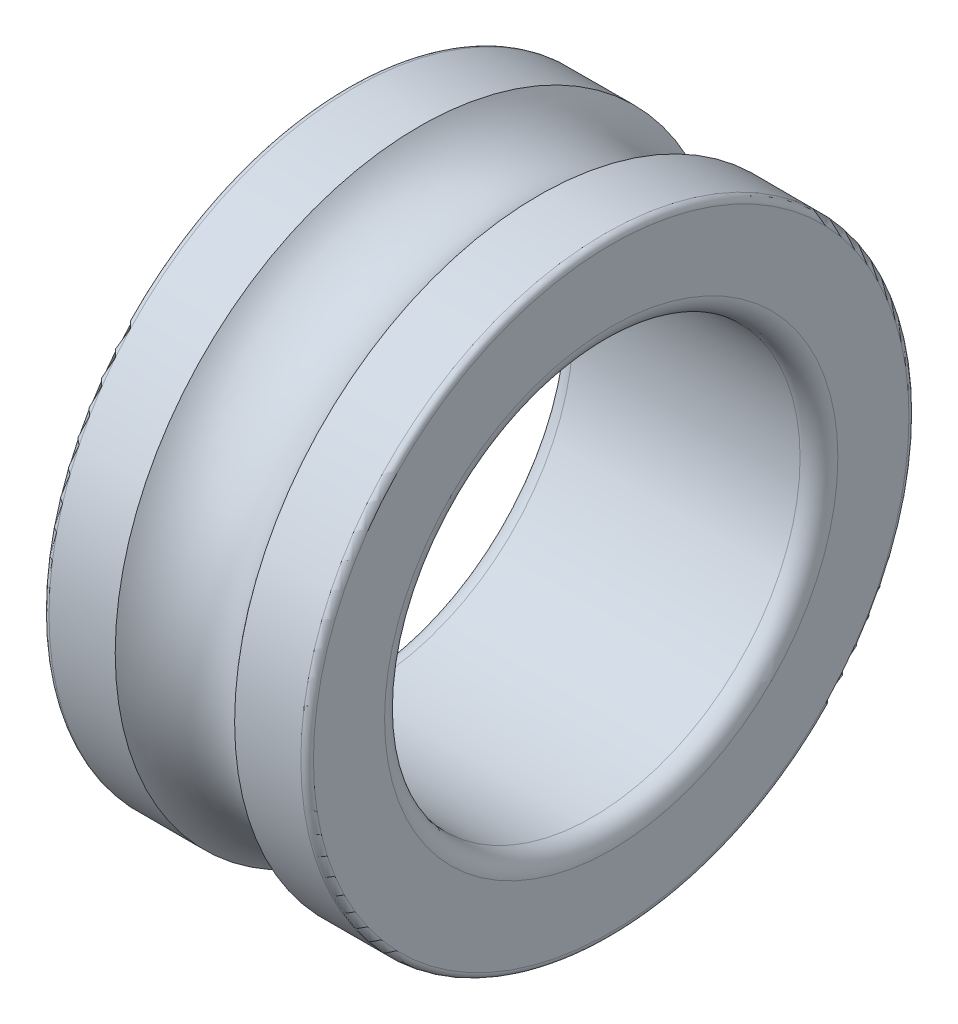
ISO-10303-21;
HEADER;
FILE_DESCRIPTION(('STEP AP214'),'2;1');
FILE_NAME('part.step','',(''),(''),'','','');
FILE_SCHEMA(('AUTOMOTIVE_DESIGN { 1 0 10303 214 1 1 1 1 }'));
ENDSEC;
DATA;
#1=APPLICATION_CONTEXT('core data for automotive mechanical design processes');
#2=APPLICATION_PROTOCOL_DEFINITION('international standard','automotive_design',2000,#1);
#3=PRODUCT_CONTEXT('',#1,'mechanical');
#4=PRODUCT('Part','Part','',(#3));
#5=PRODUCT_RELATED_PRODUCT_CATEGORY('part','',(#4));
#6=PRODUCT_DEFINITION_FORMATION('','',#4);
#7=PRODUCT_DEFINITION_CONTEXT('part definition',#1,'design');
#8=PRODUCT_DEFINITION('design','',#6,#7);
#9=PRODUCT_DEFINITION_SHAPE('','',#8);
#10=(LENGTH_UNIT() NAMED_UNIT(*) SI_UNIT(.MILLI.,.METRE.));
#11=(NAMED_UNIT(*) PLANE_ANGLE_UNIT() SI_UNIT($,.RADIAN.));
#12=(NAMED_UNIT(*) SI_UNIT($,.STERADIAN.) SOLID_ANGLE_UNIT());
#13=UNCERTAINTY_MEASURE_WITH_UNIT(LENGTH_MEASURE(1.E-05),#10,'distance_accuracy_value','');
#14=(GEOMETRIC_REPRESENTATION_CONTEXT(3) GLOBAL_UNCERTAINTY_ASSIGNED_CONTEXT((#13)) GLOBAL_UNIT_ASSIGNED_CONTEXT((#10,
#11,#12)) REPRESENTATION_CONTEXT('',''));
#15=CARTESIAN_POINT('',(0.,0.,0.));
#16=DIRECTION('',(0.,0.,1.));
#17=DIRECTION('',(1.,0.,0.));
#18=AXIS2_PLACEMENT_3D('',#15,#16,#17);
#19=CARTESIAN_POINT('',(7.,0.,0.));
#20=DIRECTION('',(1.,0.,0.));
#21=DIRECTION('',(0.,0.,-1.));
#22=AXIS2_PLACEMENT_3D('',#19,#20,#21);
#23=TOROIDAL_SURFACE('',#22,18.5,3.969);
#24=CARTESIAN_POINT('',(3.83883549937684,0.,0.));
#25=DIRECTION('',(-1.,0.,0.));
#26=DIRECTION('',(0.,0.,1.));
#27=AXIS2_PLACEMENT_3D('',#24,#25,#26);
#28=CIRCLE('',#27,16.1);
#29=CARTESIAN_POINT('',(3.83883549937684,0.,16.1));
#30=VERTEX_POINT('',#29);
#31=EDGE_CURVE('E142',#30,#30,#28,.T.);
#32=ORIENTED_EDGE('',*,*,#31,.F.);
#33=EDGE_LOOP('',(#32));
#34=FACE_BOUND('',#33,.T.);
#35=CARTESIAN_POINT('',(10.1611645006232,0.,0.));
#36=DIRECTION('',(-1.,0.,0.));
#37=DIRECTION('',(0.,0.,1.));
#38=AXIS2_PLACEMENT_3D('',#35,#36,#37);
#39=CIRCLE('',#38,16.1);
#40=CARTESIAN_POINT('',(10.1611645006232,0.,16.1));
#41=VERTEX_POINT('',#40);
#42=EDGE_CURVE('E150',#41,#41,#39,.F.);
#43=ORIENTED_EDGE('',*,*,#42,.F.);
#44=EDGE_LOOP('',(#43));
#45=FACE_BOUND('',#44,.T.);
#46=ADVANCED_FACE('F14',(#34,#45),#23,.F.);
#47=CARTESIAN_POINT('',(100.,0.,0.));
#48=DIRECTION('',(-1.,0.,0.));
#49=DIRECTION('',(0.,0.,1.));
#50=AXIS2_PLACEMENT_3D('',#47,#48,#49);
#51=CYLINDRICAL_SURFACE('',#50,16.1);
#52=CARTESIAN_POINT('',(13.6666666666667,0.,0.));
#53=DIRECTION('',(1.,0.,0.));
#54=DIRECTION('',(0.,0.,-1.));
#55=AXIS2_PLACEMENT_3D('',#52,#53,#54);
#56=CIRCLE('',#55,16.1);
#57=CARTESIAN_POINT('',(13.6666666666667,0.,-16.1));
#58=VERTEX_POINT('',#57);
#59=EDGE_CURVE('E112',#58,#58,#56,.T.);
#60=ORIENTED_EDGE('',*,*,#59,.F.);
#61=EDGE_LOOP('',(#60));
#62=FACE_BOUND('',#61,.T.);
#63=ORIENTED_EDGE('',*,*,#42,.T.);
#64=EDGE_LOOP('',(#63));
#65=FACE_BOUND('',#64,.T.);
#66=ADVANCED_FACE('F157',(#62,#65),#51,.T.);
#67=CARTESIAN_POINT('',(100.,0.,0.));
#68=DIRECTION('',(-1.,0.,0.));
#69=DIRECTION('',(0.,0.,1.));
#70=AXIS2_PLACEMENT_3D('',#67,#68,#69);
#71=CYLINDRICAL_SURFACE('',#70,16.1);
#72=ORIENTED_EDGE('',*,*,#31,.T.);
#73=EDGE_LOOP('',(#72));
#74=FACE_BOUND('',#73,.T.);
#75=CARTESIAN_POINT('',(0.333333333333336,0.,0.));
#76=DIRECTION('',(1.,0.,0.));
#77=DIRECTION('',(0.,0.,-1.));
#78=AXIS2_PLACEMENT_3D('',#75,#76,#77);
#79=CIRCLE('',#78,16.1);
#80=CARTESIAN_POINT('',(0.333333333333336,0.,-16.1));
#81=VERTEX_POINT('',#80);
#82=EDGE_CURVE('E109',#81,#81,#79,.F.);
#83=ORIENTED_EDGE('',*,*,#82,.F.);
#84=EDGE_LOOP('',(#83));
#85=FACE_BOUND('',#84,.T.);
#86=ADVANCED_FACE('F135',(#74,#85),#71,.T.);
#87=CARTESIAN_POINT('',(13.6666666666667,0.,0.));
#88=DIRECTION('',(1.,0.,0.));
#89=DIRECTION('',(0.,0.,-1.));
#90=AXIS2_PLACEMENT_3D('',#87,#88,#89);
#91=TOROIDAL_SURFACE('',#90,15.7666666667,0.3333333333);
#92=CARTESIAN_POINT('',(13.9999999999667,0.,0.));
#93=DIRECTION('',(-1.,0.,0.));
#94=DIRECTION('',(0.,0.,-1.));
#95=AXIS2_PLACEMENT_3D('',#92,#93,#94);
#96=CIRCLE('',#95,15.7666666666667);
#97=CARTESIAN_POINT('',(13.9999999999667,0.,-15.7666666666667));
#98=VERTEX_POINT('',#97);
#99=EDGE_CURVE('E64',#98,#98,#96,.F.);
#100=ORIENTED_EDGE('',*,*,#99,.F.);
#101=EDGE_LOOP('',(#100));
#102=FACE_BOUND('',#101,.T.);
#103=ORIENTED_EDGE('',*,*,#59,.T.);
#104=EDGE_LOOP('',(#103));
#105=FACE_BOUND('',#104,.T.);
#106=ADVANCED_FACE('F131',(#102,#105),#91,.T.);
#107=CARTESIAN_POINT('',(0.333333333333336,0.,0.));
#108=DIRECTION('',(1.,0.,0.));
#109=DIRECTION('',(0.,0.,-1.));
#110=AXIS2_PLACEMENT_3D('',#107,#108,#109);
#111=TOROIDAL_SURFACE('',#110,15.7666666667,0.3333333333);
#112=ORIENTED_EDGE('',*,*,#82,.T.);
#113=EDGE_LOOP('',(#112));
#114=FACE_BOUND('',#113,.T.);
#115=CARTESIAN_POINT('',(3.33360184075204E-11,0.,0.));
#116=DIRECTION('',(1.,0.,0.));
#117=DIRECTION('',(0.,0.,-1.));
#118=AXIS2_PLACEMENT_3D('',#115,#116,#117);
#119=CIRCLE('',#118,15.7666666666667);
#120=CARTESIAN_POINT('',(3.33360184075204E-11,0.,-15.7666666666667));
#121=VERTEX_POINT('',#120);
#122=EDGE_CURVE('E119',#121,#121,#119,.F.);
#123=ORIENTED_EDGE('',*,*,#122,.F.);
#124=EDGE_LOOP('',(#123));
#125=FACE_BOUND('',#124,.T.);
#126=ADVANCED_FACE('F81',(#114,#125),#111,.T.);
#127=CARTESIAN_POINT('',(14.,12.,0.));
#128=DIRECTION('',(1.,0.,0.));
#129=DIRECTION('',(0.,0.,-1.));
#130=AXIS2_PLACEMENT_3D('',#127,#128,#129);
#131=PLANE('',#130);
#132=CARTESIAN_POINT('',(14.,0.,0.));
#133=DIRECTION('',(1.,0.,0.));
#134=DIRECTION('',(0.,0.,-1.));
#135=AXIS2_PLACEMENT_3D('',#132,#133,#134);
#136=CIRCLE('',#135,12.);
#137=CARTESIAN_POINT('',(14.,0.,-12.));
#138=VERTEX_POINT('',#137);
#139=EDGE_CURVE('E99',#138,#138,#136,.T.);
#140=ORIENTED_EDGE('',*,*,#139,.F.);
#141=EDGE_LOOP('',(#140));
#142=FACE_BOUND('',#141,.T.);
#143=ORIENTED_EDGE('',*,*,#99,.T.);
#144=EDGE_LOOP('',(#143));
#145=FACE_BOUND('',#144,.T.);
#146=ADVANCED_FACE('F71',(#142,#145),#131,.T.);
#147=CARTESIAN_POINT('',(0.,15.7666666666667,0.));
#148=DIRECTION('',(-1.,0.,0.));
#149=DIRECTION('',(0.,0.,1.));
#150=AXIS2_PLACEMENT_3D('',#147,#148,#149);
#151=PLANE('',#150);
#152=ORIENTED_EDGE('',*,*,#122,.T.);
#153=EDGE_LOOP('',(#152));
#154=FACE_BOUND('',#153,.T.);
#155=CARTESIAN_POINT('',(0.,0.,0.));
#156=DIRECTION('',(-1.,0.,0.));
#157=DIRECTION('',(0.,0.,-1.));
#158=AXIS2_PLACEMENT_3D('',#155,#156,#157);
#159=CIRCLE('',#158,12.);
#160=CARTESIAN_POINT('',(0.,0.,-12.));
#161=VERTEX_POINT('',#160);
#162=EDGE_CURVE('E26',#161,#161,#159,.T.);
#163=ORIENTED_EDGE('',*,*,#162,.F.);
#164=EDGE_LOOP('',(#163));
#165=FACE_BOUND('',#164,.T.);
#166=ADVANCED_FACE('F80',(#154,#165),#151,.T.);
#167=CARTESIAN_POINT('',(13.,0.,0.));
#168=DIRECTION('',(1.,0.,0.));
#169=DIRECTION('',(0.,0.,-1.));
#170=AXIS2_PLACEMENT_3D('',#167,#168,#169);
#171=TOROIDAL_SURFACE('',#170,12.,1.);
#172=CARTESIAN_POINT('',(13.,0.,0.));
#173=DIRECTION('',(-1.,0.,0.));
#174=DIRECTION('',(0.,0.,1.));
#175=AXIS2_PLACEMENT_3D('',#172,#173,#174);
#176=CIRCLE('',#175,11.);
#177=CARTESIAN_POINT('',(13.,0.,11.));
#178=VERTEX_POINT('',#177);
#179=EDGE_CURVE('E21',#178,#178,#176,.T.);
#180=ORIENTED_EDGE('',*,*,#179,.T.);
#181=EDGE_LOOP('',(#180));
#182=FACE_BOUND('',#181,.T.);
#183=ORIENTED_EDGE('',*,*,#139,.T.);
#184=EDGE_LOOP('',(#183));
#185=FACE_BOUND('',#184,.T.);
#186=ADVANCED_FACE('F44',(#182,#185),#171,.T.);
#187=CARTESIAN_POINT('',(1.,0.,0.));
#188=DIRECTION('',(1.,0.,0.));
#189=DIRECTION('',(0.,0.,-1.));
#190=AXIS2_PLACEMENT_3D('',#187,#188,#189);
#191=TOROIDAL_SURFACE('',#190,12.,1.);
#192=ORIENTED_EDGE('',*,*,#162,.T.);
#193=EDGE_LOOP('',(#192));
#194=FACE_BOUND('',#193,.T.);
#195=CARTESIAN_POINT('',(1.,0.,0.));
#196=DIRECTION('',(-1.,0.,0.));
#197=DIRECTION('',(0.,0.,1.));
#198=AXIS2_PLACEMENT_3D('',#195,#196,#197);
#199=CIRCLE('',#198,11.);
#200=CARTESIAN_POINT('',(1.,0.,11.));
#201=VERTEX_POINT('',#200);
#202=EDGE_CURVE('E10',#201,#201,#199,.F.);
#203=ORIENTED_EDGE('',*,*,#202,.T.);
#204=EDGE_LOOP('',(#203));
#205=FACE_BOUND('',#204,.T.);
#206=ADVANCED_FACE('F38',(#194,#205),#191,.T.);
#207=CARTESIAN_POINT('',(100.,0.,0.));
#208=DIRECTION('',(-1.,0.,0.));
#209=DIRECTION('',(0.,0.,1.));
#210=AXIS2_PLACEMENT_3D('',#207,#208,#209);
#211=CYLINDRICAL_SURFACE('',#210,11.);
#212=ORIENTED_EDGE('',*,*,#202,.F.);
#213=EDGE_LOOP('',(#212));
#214=FACE_BOUND('',#213,.T.);
#215=ORIENTED_EDGE('',*,*,#179,.F.);
#216=EDGE_LOOP('',(#215));
#217=FACE_BOUND('',#216,.T.);
#218=ADVANCED_FACE('F43',(#214,#217),#211,.F.);
#219=CLOSED_SHELL('',(#46,#66,#86,#106,#126,#146,#166,#186,#206,#218));
#220=MANIFOLD_SOLID_BREP('B1',#219);
#221=ADVANCED_BREP_SHAPE_REPRESENTATION('',(#18,#220),#14);
#222=SHAPE_DEFINITION_REPRESENTATION(#9,#221);
ENDSEC;
END-ISO-10303-21;
